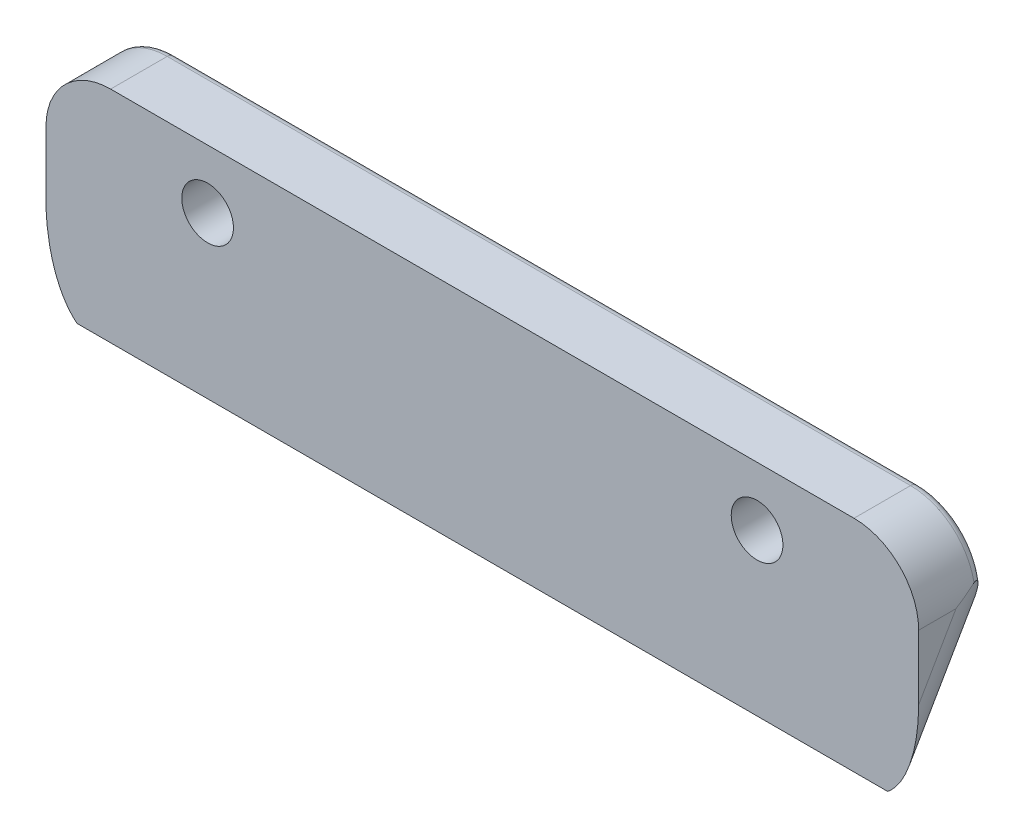
ISO-10303-21;
HEADER;
FILE_DESCRIPTION(('STEP AP214'),'2;1');
FILE_NAME('part.step','',(''),(''),'','','');
FILE_SCHEMA(('AUTOMOTIVE_DESIGN { 1 0 10303 214 1 1 1 1 }'));
ENDSEC;
DATA;
#1=APPLICATION_CONTEXT('core data for automotive mechanical design processes');
#2=APPLICATION_PROTOCOL_DEFINITION('international standard','automotive_design',2000,#1);
#3=PRODUCT_CONTEXT('',#1,'mechanical');
#4=PRODUCT('Part','Part','',(#3));
#5=PRODUCT_RELATED_PRODUCT_CATEGORY('part','',(#4));
#6=PRODUCT_DEFINITION_FORMATION('','',#4);
#7=PRODUCT_DEFINITION_CONTEXT('part definition',#1,'design');
#8=PRODUCT_DEFINITION('design','',#6,#7);
#9=PRODUCT_DEFINITION_SHAPE('','',#8);
#10=(LENGTH_UNIT() NAMED_UNIT(*) SI_UNIT(.MILLI.,.METRE.));
#11=(NAMED_UNIT(*) PLANE_ANGLE_UNIT() SI_UNIT($,.RADIAN.));
#12=(NAMED_UNIT(*) SI_UNIT($,.STERADIAN.) SOLID_ANGLE_UNIT());
#13=UNCERTAINTY_MEASURE_WITH_UNIT(LENGTH_MEASURE(1.E-05),#10,'distance_accuracy_value','');
#14=(GEOMETRIC_REPRESENTATION_CONTEXT(3) GLOBAL_UNCERTAINTY_ASSIGNED_CONTEXT((#13)) GLOBAL_UNIT_ASSIGNED_CONTEXT((#10,
#11,#12)) REPRESENTATION_CONTEXT('',''));
#15=CARTESIAN_POINT('',(0.,0.,0.));
#16=DIRECTION('',(0.,0.,1.));
#17=DIRECTION('',(1.,0.,0.));
#18=AXIS2_PLACEMENT_3D('',#15,#16,#17);
#19=CARTESIAN_POINT('',(73.,7.,0.));
#20=DIRECTION('',(0.,0.,-1.));
#21=DIRECTION('',(0.,1.,0.));
#22=AXIS2_PLACEMENT_3D('',#19,#20,#21);
#23=PLANE('',#22);
#24=CARTESIAN_POINT('',(68.,5.18,0.));
#25=DIRECTION('',(0.,0.,-1.));
#26=DIRECTION('',(-1.,0.,0.));
#27=AXIS2_PLACEMENT_3D('',#24,#25,#26);
#28=CIRCLE('',#27,0.799999999999995);
#29=CARTESIAN_POINT('',(67.2,5.18,0.));
#30=VERTEX_POINT('',#29);
#31=EDGE_CURVE('E237',#30,#30,#28,.T.);
#32=ORIENTED_EDGE('',*,*,#31,.T.);
#33=EDGE_LOOP('',(#32));
#34=FACE_BOUND('',#33,.T.);
#35=CARTESIAN_POINT('',(51.,5.18,0.));
#36=DIRECTION('',(0.,0.,-1.));
#37=DIRECTION('',(-1.,0.,0.));
#38=AXIS2_PLACEMENT_3D('',#35,#36,#37);
#39=CIRCLE('',#38,0.800000000000002);
#40=CARTESIAN_POINT('',(50.2,5.18,0.));
#41=VERTEX_POINT('',#40);
#42=EDGE_CURVE('E249',#41,#41,#39,.T.);
#43=ORIENTED_EDGE('',*,*,#42,.T.);
#44=EDGE_LOOP('',(#43));
#45=FACE_BOUND('',#44,.T.);
#46=DIRECTION('',(-1.,0.,0.));
#47=VECTOR('',#46,1.);
#48=CARTESIAN_POINT('',(73.,7.,0.));
#49=LINE('',#48,#47);
#50=CARTESIAN_POINT('',(71.,7.,0.));
#51=VERTEX_POINT('',#50);
#52=CARTESIAN_POINT('',(48.,7.,0.));
#53=VERTEX_POINT('',#52);
#54=EDGE_CURVE('E157',#51,#53,#49,.T.);
#55=ORIENTED_EDGE('',*,*,#54,.T.);
#56=CARTESIAN_POINT('',(48.,5.,0.));
#57=DIRECTION('',(0.,0.,-1.));
#58=DIRECTION('',(0.,1.,0.));
#59=AXIS2_PLACEMENT_3D('',#56,#57,#58);
#60=CIRCLE('',#59,2.);
#61=CARTESIAN_POINT('',(46.,5.,0.));
#62=VERTEX_POINT('',#61);
#63=EDGE_CURVE('E302',#53,#62,#60,.F.);
#64=ORIENTED_EDGE('',*,*,#63,.T.);
#65=DIRECTION('',(0.,-1.,0.));
#66=VECTOR('',#65,1.);
#67=CARTESIAN_POINT('',(46.,7.,0.));
#68=LINE('',#67,#66);
#69=CARTESIAN_POINT('',(46.,3.00000000000004,0.));
#70=VERTEX_POINT('',#69);
#71=EDGE_CURVE('E253',#62,#70,#68,.T.);
#72=ORIENTED_EDGE('',*,*,#71,.T.);
#73=CARTESIAN_POINT('',(47.5,3.00000000000004,0.));
#74=DIRECTION('',(0.,0.,-1.));
#75=DIRECTION('',(0.,1.,0.));
#76=AXIS2_PLACEMENT_3D('',#73,#74,#75);
#77=ELLIPSE('',#76,3.00000000000004,1.5);
#78=CARTESIAN_POINT('',(46.9614835192866,0.200000000000001,0.));
#79=VERTEX_POINT('',#78);
#80=EDGE_CURVE('E285',#70,#79,#77,.F.);
#81=ORIENTED_EDGE('',*,*,#80,.T.);
#82=DIRECTION('',(-1.,0.,0.));
#83=VECTOR('',#82,1.);
#84=CARTESIAN_POINT('',(73.,0.200000000000001,0.));
#85=LINE('',#84,#83);
#86=CARTESIAN_POINT('',(72.0385164807134,0.200000000000001,0.));
#87=VERTEX_POINT('',#86);
#88=EDGE_CURVE('E139',#87,#79,#85,.T.);
#89=ORIENTED_EDGE('',*,*,#88,.F.);
#90=CARTESIAN_POINT('',(71.5,3.00000000000004,0.));
#91=DIRECTION('',(0.,0.,-1.));
#92=DIRECTION('',(0.,-1.,0.));
#93=AXIS2_PLACEMENT_3D('',#90,#91,#92);
#94=ELLIPSE('',#93,3.00000000000004,1.5);
#95=CARTESIAN_POINT('',(73.,3.00000000000004,0.));
#96=VERTEX_POINT('',#95);
#97=EDGE_CURVE('E143',#87,#96,#94,.F.);
#98=ORIENTED_EDGE('',*,*,#97,.T.);
#99=DIRECTION('',(0.,-1.,0.));
#100=VECTOR('',#99,1.);
#101=CARTESIAN_POINT('',(73.,7.,0.));
#102=LINE('',#101,#100);
#103=CARTESIAN_POINT('',(73.,5.,0.));
#104=VERTEX_POINT('',#103);
#105=EDGE_CURVE('E129',#104,#96,#102,.T.);
#106=ORIENTED_EDGE('',*,*,#105,.F.);
#107=CARTESIAN_POINT('',(71.,5.,0.));
#108=DIRECTION('',(0.,0.,-1.));
#109=DIRECTION('',(0.,1.,0.));
#110=AXIS2_PLACEMENT_3D('',#107,#108,#109);
#111=CIRCLE('',#110,2.);
#112=EDGE_CURVE('E173',#104,#51,#111,.F.);
#113=ORIENTED_EDGE('',*,*,#112,.T.);
#114=EDGE_LOOP('',(#55,#64,#72,#81,#89,#98,#106,#113));
#115=FACE_BOUND('',#114,.T.);
#116=ADVANCED_FACE('F42',(#34,#45,#115),#23,.F.);
#117=CARTESIAN_POINT('',(73.,0.,0.));
#118=DIRECTION('',(0.,0.499999999999993,0.866025403784442));
#119=DIRECTION('',(0.,-0.866025403784443,0.499999999999993));
#120=AXIS2_PLACEMENT_3D('',#117,#118,#119);
#121=PLANE('',#120);
#122=DIRECTION('',(1.,0.,0.));
#123=VECTOR('',#122,1.);
#124=CARTESIAN_POINT('',(73.,0.200000000000001,-0.115470053837924));
#125=LINE('',#124,#123);
#126=CARTESIAN_POINT('',(47.5,0.200000000000001,-0.115470053837924));
#127=VERTEX_POINT('',#126);
#128=CARTESIAN_POINT('',(71.5,0.200000000000001,-0.115470053837924));
#129=VERTEX_POINT('',#128);
#130=EDGE_CURVE('E256',#127,#129,#125,.T.);
#131=ORIENTED_EDGE('',*,*,#130,.F.);
#132=DIRECTION('',(0.,0.866025403784443,-0.499999999999993));
#133=VECTOR('',#132,1.);
#134=CARTESIAN_POINT('',(47.5,0.,0.));
#135=LINE('',#134,#133);
#136=CARTESIAN_POINT('',(47.5,3.46410161513782,-2.));
#137=VERTEX_POINT('',#136);
#138=EDGE_CURVE('E187',#127,#137,#135,.T.);
#139=ORIENTED_EDGE('',*,*,#138,.T.);
#140=DIRECTION('',(-1.,0.,0.));
#141=VECTOR('',#140,1.);
#142=CARTESIAN_POINT('',(73.,3.46410161513782,-2.));
#143=LINE('',#142,#141);
#144=CARTESIAN_POINT('',(71.5,3.46410161513782,-2.));
#145=VERTEX_POINT('',#144);
#146=EDGE_CURVE('E138',#145,#137,#143,.T.);
#147=ORIENTED_EDGE('',*,*,#146,.F.);
#148=DIRECTION('',(0.,0.866025403784443,-0.499999999999993));
#149=VECTOR('',#148,1.);
#150=CARTESIAN_POINT('',(71.5,0.200000000000001,-0.115470053837924));
#151=LINE('',#150,#149);
#152=EDGE_CURVE('E161',#145,#129,#151,.F.);
#153=ORIENTED_EDGE('',*,*,#152,.T.);
#154=EDGE_LOOP('',(#131,#139,#147,#153));
#155=FACE_BOUND('',#154,.T.);
#156=ADVANCED_FACE('F273',(#155),#121,.F.);
#157=CARTESIAN_POINT('',(73.,0.,0.));
#158=DIRECTION('',(1.,0.,0.));
#159=DIRECTION('',(0.,0.,-1.));
#160=AXIS2_PLACEMENT_3D('',#157,#158,#159);
#161=PLANE('',#160);
#162=DIRECTION('',(0.,0.866025403784443,-0.499999999999993));
#163=VECTOR('',#162,1.);
#164=CARTESIAN_POINT('',(73.,4.21410161513781,-0.700961894323337));
#165=LINE('',#164,#163);
#166=CARTESIAN_POINT('',(73.,5.,-1.15470053837921));
#167=VERTEX_POINT('',#166);
#168=EDGE_CURVE('E133',#96,#167,#165,.T.);
#169=ORIENTED_EDGE('',*,*,#168,.T.);
#170=DIRECTION('',(0.,0.,1.));
#171=VECTOR('',#170,1.);
#172=CARTESIAN_POINT('',(73.,5.,0.));
#173=LINE('',#172,#171);
#174=EDGE_CURVE('E135',#167,#104,#173,.T.);
#175=ORIENTED_EDGE('',*,*,#174,.T.);
#176=ORIENTED_EDGE('',*,*,#105,.T.);
#177=EDGE_LOOP('',(#169,#175,#176));
#178=FACE_BOUND('',#177,.T.);
#179=ADVANCED_FACE('F131',(#178),#161,.T.);
#180=CARTESIAN_POINT('',(73.,7.,-2.));
#181=DIRECTION('',(0.,-1.,0.));
#182=DIRECTION('',(0.,0.,-1.));
#183=AXIS2_PLACEMENT_3D('',#180,#181,#182);
#184=PLANE('',#183);
#185=DIRECTION('',(0.,0.,1.));
#186=VECTOR('',#185,1.);
#187=CARTESIAN_POINT('',(71.,7.,-2.));
#188=LINE('',#187,#186);
#189=CARTESIAN_POINT('',(71.,7.,-1.75));
#190=VERTEX_POINT('',#189);
#191=EDGE_CURVE('E176',#51,#190,#188,.F.);
#192=ORIENTED_EDGE('',*,*,#191,.T.);
#193=DIRECTION('',(-1.,0.,0.));
#194=VECTOR('',#193,1.);
#195=CARTESIAN_POINT('',(73.,7.,-1.75));
#196=LINE('',#195,#194);
#197=CARTESIAN_POINT('',(48.,7.,-1.75));
#198=VERTEX_POINT('',#197);
#199=EDGE_CURVE('E11',#190,#198,#196,.T.);
#200=ORIENTED_EDGE('',*,*,#199,.T.);
#201=DIRECTION('',(0.,0.,-1.));
#202=VECTOR('',#201,1.);
#203=CARTESIAN_POINT('',(48.,7.,-2.));
#204=LINE('',#203,#202);
#205=EDGE_CURVE('E299',#198,#53,#204,.F.);
#206=ORIENTED_EDGE('',*,*,#205,.T.);
#207=ORIENTED_EDGE('',*,*,#54,.F.);
#208=EDGE_LOOP('',(#192,#200,#206,#207));
#209=FACE_BOUND('',#208,.T.);
#210=ADVANCED_FACE('F342',(#209),#184,.F.);
#211=CARTESIAN_POINT('',(73.,3.46410161513782,-2.));
#212=DIRECTION('',(0.,0.,1.));
#213=DIRECTION('',(1.,0.,0.));
#214=AXIS2_PLACEMENT_3D('',#211,#212,#213);
#215=PLANE('',#214);
#216=CARTESIAN_POINT('',(68.,5.18,-2.));
#217=DIRECTION('',(0.,0.,-1.));
#218=DIRECTION('',(-1.,0.,0.));
#219=AXIS2_PLACEMENT_3D('',#216,#217,#218);
#220=CIRCLE('',#219,0.799999999999995);
#221=CARTESIAN_POINT('',(67.2,5.18,-2.));
#222=VERTEX_POINT('',#221);
#223=EDGE_CURVE('E231',#222,#222,#220,.T.);
#224=ORIENTED_EDGE('',*,*,#223,.F.);
#225=EDGE_LOOP('',(#224));
#226=FACE_BOUND('',#225,.T.);
#227=CARTESIAN_POINT('',(51.,5.18,-2.));
#228=DIRECTION('',(0.,0.,-1.));
#229=DIRECTION('',(-1.,0.,0.));
#230=AXIS2_PLACEMENT_3D('',#227,#228,#229);
#231=CIRCLE('',#230,0.799999999999988);
#232=CARTESIAN_POINT('',(50.2,5.18,-2.));
#233=VERTEX_POINT('',#232);
#234=EDGE_CURVE('E243',#233,#233,#231,.T.);
#235=ORIENTED_EDGE('',*,*,#234,.F.);
#236=EDGE_LOOP('',(#235));
#237=FACE_BOUND('',#236,.T.);
#238=DIRECTION('',(-1.,0.,0.));
#239=VECTOR('',#238,1.);
#240=CARTESIAN_POINT('',(73.,6.75,-2.));
#241=LINE('',#240,#239);
#242=CARTESIAN_POINT('',(48.,6.75,-2.));
#243=VERTEX_POINT('',#242);
#244=CARTESIAN_POINT('',(71.,6.75,-2.));
#245=VERTEX_POINT('',#244);
#246=EDGE_CURVE('E305',#243,#245,#241,.F.);
#247=ORIENTED_EDGE('',*,*,#246,.T.);
#248=CARTESIAN_POINT('',(71.,5.,-2.));
#249=DIRECTION('',(0.,0.,1.));
#250=DIRECTION('',(1.,0.,0.));
#251=AXIS2_PLACEMENT_3D('',#248,#249,#250);
#252=CIRCLE('',#251,1.75);
#253=CARTESIAN_POINT('',(72.7327558935881,4.75493467557492,-2.));
#254=VERTEX_POINT('',#253);
#255=EDGE_CURVE('E313',#245,#254,#252,.F.);
#256=ORIENTED_EDGE('',*,*,#255,.T.);
#257=CARTESIAN_POINT('',(71.5,6.46410161513786,-2.));
#258=DIRECTION('',(0.,0.,1.));
#259=DIRECTION('',(0.,-1.,0.));
#260=AXIS2_PLACEMENT_3D('',#257,#258,#259);
#261=ELLIPSE('',#260,3.00000000000004,1.5);
#262=EDGE_CURVE('E156',#254,#145,#261,.F.);
#263=ORIENTED_EDGE('',*,*,#262,.T.);
#264=ORIENTED_EDGE('',*,*,#146,.T.);
#265=CARTESIAN_POINT('',(47.5,6.46410161513786,-2.));
#266=DIRECTION('',(0.,0.,1.));
#267=DIRECTION('',(0.,1.,0.));
#268=AXIS2_PLACEMENT_3D('',#265,#266,#267);
#269=ELLIPSE('',#268,3.00000000000004,1.5);
#270=CARTESIAN_POINT('',(46.2672441064119,4.75493467557492,-2.));
#271=VERTEX_POINT('',#270);
#272=EDGE_CURVE('E266',#137,#271,#269,.F.);
#273=ORIENTED_EDGE('',*,*,#272,.T.);
#274=CARTESIAN_POINT('',(48.,5.,-2.));
#275=DIRECTION('',(0.,0.,1.));
#276=DIRECTION('',(1.,0.,0.));
#277=AXIS2_PLACEMENT_3D('',#274,#275,#276);
#278=CIRCLE('',#277,1.75);
#279=EDGE_CURVE('E310',#271,#243,#278,.F.);
#280=ORIENTED_EDGE('',*,*,#279,.T.);
#281=EDGE_LOOP('',(#247,#256,#263,#264,#273,#280));
#282=FACE_BOUND('',#281,.T.);
#283=ADVANCED_FACE('F265',(#226,#237,#282),#215,.F.);
#284=CARTESIAN_POINT('',(73.,0.200000000000001,-5.));
#285=DIRECTION('',(0.,-1.,0.));
#286=DIRECTION('',(0.,0.,-1.));
#287=AXIS2_PLACEMENT_3D('',#284,#285,#286);
#288=PLANE('',#287);
#289=ORIENTED_EDGE('',*,*,#88,.T.);
#290=CARTESIAN_POINT('',(47.5,0.2,1.61658075373095));
#291=DIRECTION('',(0.,-1.,0.));
#292=DIRECTION('',(0.,0.,-1.));
#293=AXIS2_PLACEMENT_3D('',#290,#291,#292);
#294=ELLIPSE('',#293,1.73205080756887,1.5);
#295=EDGE_CURVE('E278',#79,#127,#294,.T.);
#296=ORIENTED_EDGE('',*,*,#295,.T.);
#297=ORIENTED_EDGE('',*,*,#130,.T.);
#298=CARTESIAN_POINT('',(71.5,0.2,1.61658075373094));
#299=DIRECTION('',(0.,-1.,0.));
#300=DIRECTION('',(0.,0.,1.));
#301=AXIS2_PLACEMENT_3D('',#298,#299,#300);
#302=ELLIPSE('',#301,1.73205080756887,1.5);
#303=EDGE_CURVE('E149',#129,#87,#302,.T.);
#304=ORIENTED_EDGE('',*,*,#303,.T.);
#305=EDGE_LOOP('',(#289,#296,#297,#304));
#306=FACE_BOUND('',#305,.T.);
#307=ADVANCED_FACE('F276',(#306),#288,.T.);
#308=CARTESIAN_POINT('',(71.5,0.749999999999989,1.29903810567666));
#309=DIRECTION('',(0.,-0.866025403784443,0.499999999999993));
#310=DIRECTION('',(0.,-0.499999999999993,-0.866025403784443));
#311=AXIS2_PLACEMENT_3D('',#308,#309,#310);
#312=CYLINDRICAL_SURFACE('',#311,1.5);
#313=ORIENTED_EDGE('',*,*,#262,.F.);
#314=CARTESIAN_POINT('',(72.7327558935881,4.75493467557493,-2.));
#315=CARTESIAN_POINT('',(72.7395170974083,4.77444049978442,-1.99999775763626));
#316=CARTESIAN_POINT('',(72.7461756716318,4.79398250895714,-1.99990602112907));
#317=CARTESIAN_POINT('',(72.7593230730698,4.83312800297112,-1.99945471471934));
#318=CARTESIAN_POINT('',(72.7658118394572,4.8527315070991,-1.99909505016552));
#319=CARTESIAN_POINT('',(72.7852432670711,4.91212775323866,-1.99746630332613));
#320=CARTESIAN_POINT('',(72.7979699111735,4.95197764912317,-1.99564259078778));
#321=CARTESIAN_POINT('',(72.8233529867402,5.03233978980987,-1.98940656331436));
#322=CARTESIAN_POINT('',(72.8360040362125,5.07285105322397,-1.98494826958053));
#323=CARTESIAN_POINT('',(72.8548885432478,5.13296902294581,-1.97486735389876));
#324=CARTESIAN_POINT('',(72.8611511689767,5.15284713828531,-1.97095663186988));
#325=CARTESIAN_POINT('',(72.8736752519363,5.1922409568881,-1.96163079661194));
#326=CARTESIAN_POINT('',(72.8799367026208,5.21175704109388,-1.95621737309272));
#327=CARTESIAN_POINT('',(72.8898343711833,5.24204076938239,-1.94605657531098));
#328=CARTESIAN_POINT('',(72.8934670811476,5.2530355185594,-1.94198672323065));
#329=CARTESIAN_POINT('',(72.9007516942952,5.27472893262587,-1.93298748702939));
#330=CARTESIAN_POINT('',(72.9044036122319,5.28542610159674,-1.92805444115827));
#331=CARTESIAN_POINT('',(72.9127244853669,5.30920930509752,-1.91562471093036));
#332=CARTESIAN_POINT('',(72.9173921004261,5.32212626396022,-1.90779692010482));
#333=CARTESIAN_POINT('',(72.9266538936081,5.34630250290987,-1.88988426453134));
#334=CARTESIAN_POINT('',(72.9312483603601,5.3575743404792,-1.87981815907657));
#335=CARTESIAN_POINT('',(72.9374496696154,5.37090070312588,-1.86384792442803));
#336=CARTESIAN_POINT('',(72.939161571736,5.37437001478333,-1.85917471218608));
#337=CARTESIAN_POINT('',(72.942527484565,5.38063878533565,-1.84936723691236));
#338=CARTESIAN_POINT('',(72.9441814695126,5.38343794930872,-1.84423277225237));
#339=CARTESIAN_POINT('',(72.9474130937451,5.38818355748631,-1.83347214001841));
#340=CARTESIAN_POINT('',(72.948989586239,5.3901194257173,-1.8278408353296));
#341=CARTESIAN_POINT('',(72.951989442459,5.39285820087968,-1.81627573374772));
#342=CARTESIAN_POINT('',(72.9534131932607,5.39366403730887,-1.81034276048165));
#343=CARTESIAN_POINT('',(72.9559223029142,5.3939962904921,-1.79901024729969));
#344=CARTESIAN_POINT('',(72.9570274047894,5.39364577185487,-1.79361860380967));
#345=CARTESIAN_POINT('',(72.9590552908755,5.391946304517,-1.7829467237814));
#346=CARTESIAN_POINT('',(72.9599776117549,5.39059485858582,-1.7776667999229));
#347=CARTESIAN_POINT('',(72.9614448434276,5.38742796238778,-1.76857350672998));
#348=CARTESIAN_POINT('',(72.9620277839896,5.38579034628646,-1.76470180302338));
#349=CARTESIAN_POINT('',(72.9630884674966,5.38208304500356,-1.7571821587168));
#350=CARTESIAN_POINT('',(72.9635667838573,5.38001584259055,-1.75353308172655));
#351=CARTESIAN_POINT('',(72.9639989042006,5.3777675267924,-1.75000000000027));
#352=B_SPLINE_CURVE_WITH_KNOTS('',3,(#314,#315,#316,#317,#318,#319,#320,#321,#322,#323,#324,
#325,#326,#327,#328,#329,#330,#331,#332,#333,#334,#335,#336,#337,#338,#339,#340,#341,#342,#343,
#344,#345,#346,#347,#348,#349,#350,#351),.UNSPECIFIED.,.F.,.F.,(4,2,2,2,2,2,2,2,2,2,2,2,2,2,2,2,
2,2,4),(0.,0.0619335280278836,0.123888945772995,0.249475074404342,0.377320500881206,
0.440899190720418,0.5044066772129,0.541202845028607,0.57815906713712,0.62545584420112,
0.67237024330051,0.690527962694336,0.708693658395345,0.72707616243203,0.74541092295429,
0.761859944604576,0.778350144032809,0.791053346399666,0.803685077327109),.UNSPECIFIED.);
#353=CARTESIAN_POINT('',(72.9639989042011,5.37776752679322,-1.74999999999999));
#354=VERTEX_POINT('',#353);
#355=EDGE_CURVE('E316',#254,#354,#352,.T.);
#356=ORIENTED_EDGE('',*,*,#355,.T.);
#357=CARTESIAN_POINT('',(72.9265702218557,5.53696106028184,-2.));
#358=CARTESIAN_POINT('',(72.9388757188599,5.4927860477756,-1.93074399078035));
#359=CARTESIAN_POINT('',(72.9495772662274,5.44854091117917,-1.86126870188502));
#360=CARTESIAN_POINT('',(72.9678668561814,5.35993391776195,-1.72197413472637));
#361=CARTESIAN_POINT('',(72.9754546269643,5.31557205109173,-1.65215482697154));
#362=CARTESIAN_POINT('',(72.9936512454994,5.18261292564464,-1.44274208927757));
#363=CARTESIAN_POINT('',(72.9997628618398,5.09388843759482,-1.30279543343849));
#364=CARTESIAN_POINT('',(72.9999977367986,5.00346886347651,-1.16017215074148));
#365=CARTESIAN_POINT('',(72.9999999926982,5.00173442342607,-1.15743633124916));
#366=CARTESIAN_POINT('',(73.0000000000032,5.,-1.15470053837921));
#367=B_SPLINE_CURVE_WITH_KNOTS('',3,(#357,#358,#359,#360,#361,#362,#363,#364,#365,#366),
.UNSPECIFIED.,.F.,.F.,(4,2,2,2,4),(0.,0.249136779543129,0.498295301776333,0.99518329594325,
1.00490115988303),.UNSPECIFIED.);
#368=EDGE_CURVE('E154',#354,#167,#367,.T.);
#369=ORIENTED_EDGE('',*,*,#368,.T.);
#370=ORIENTED_EDGE('',*,*,#168,.F.);
#371=ORIENTED_EDGE('',*,*,#97,.F.);
#372=ORIENTED_EDGE('',*,*,#303,.F.);
#373=ORIENTED_EDGE('',*,*,#152,.F.);
#374=EDGE_LOOP('',(#313,#356,#369,#370,#371,#372,#373));
#375=FACE_BOUND('',#374,.T.);
#376=ADVANCED_FACE('F152',(#375),#312,.T.);
#377=CARTESIAN_POINT('',(71.,5.,0.));
#378=DIRECTION('',(0.,0.,-1.));
#379=DIRECTION('',(-1.,0.,0.));
#380=AXIS2_PLACEMENT_3D('',#377,#378,#379);
#381=CYLINDRICAL_SURFACE('',#380,2.);
#382=ORIENTED_EDGE('',*,*,#368,.F.);
#383=CARTESIAN_POINT('',(71.,5.,-1.75));
#384=DIRECTION('',(0.,0.,1.));
#385=DIRECTION('',(1.,0.,0.));
#386=AXIS2_PLACEMENT_3D('',#383,#384,#385);
#387=CIRCLE('',#386,2.);
#388=EDGE_CURVE('E322',#354,#190,#387,.T.);
#389=ORIENTED_EDGE('',*,*,#388,.T.);
#390=ORIENTED_EDGE('',*,*,#191,.F.);
#391=ORIENTED_EDGE('',*,*,#112,.F.);
#392=ORIENTED_EDGE('',*,*,#174,.F.);
#393=EDGE_LOOP('',(#382,#389,#390,#391,#392));
#394=FACE_BOUND('',#393,.T.);
#395=ADVANCED_FACE('F191',(#394),#381,.T.);
#396=CARTESIAN_POINT('',(46.,7.,0.));
#397=DIRECTION('',(1.,0.,0.));
#398=DIRECTION('',(0.,0.,-1.));
#399=AXIS2_PLACEMENT_3D('',#396,#397,#398);
#400=PLANE('',#399);
#401=ORIENTED_EDGE('',*,*,#71,.F.);
#402=DIRECTION('',(0.,0.,-1.));
#403=VECTOR('',#402,1.);
#404=CARTESIAN_POINT('',(46.,5.,0.));
#405=LINE('',#404,#403);
#406=CARTESIAN_POINT('',(46.,5.,-1.15470053837921));
#407=VERTEX_POINT('',#406);
#408=EDGE_CURVE('E291',#62,#407,#405,.T.);
#409=ORIENTED_EDGE('',*,*,#408,.T.);
#410=DIRECTION('',(0.,0.866025403784443,-0.499999999999993));
#411=VECTOR('',#410,1.);
#412=CARTESIAN_POINT('',(46.,6.00000000000004,-1.73205080756884));
#413=LINE('',#412,#411);
#414=EDGE_CURVE('E282',#407,#70,#413,.F.);
#415=ORIENTED_EDGE('',*,*,#414,.T.);
#416=EDGE_LOOP('',(#401,#409,#415));
#417=FACE_BOUND('',#416,.T.);
#418=ADVANCED_FACE('F195',(#417),#400,.F.);
#419=CARTESIAN_POINT('',(47.5,0.74999999999999,1.29903810567666));
#420=DIRECTION('',(0.,0.866025403784443,-0.499999999999993));
#421=DIRECTION('',(0.,0.499999999999993,0.866025403784443));
#422=AXIS2_PLACEMENT_3D('',#419,#420,#421);
#423=CYLINDRICAL_SURFACE('',#422,1.5);
#424=CARTESIAN_POINT('',(46.0734297781443,5.53696106028185,-2.));
#425=CARTESIAN_POINT('',(46.0611242811348,5.49278604777567,-1.93074399078045));
#426=CARTESIAN_POINT('',(46.05042273377,5.4485409111793,-1.86126870188521));
#427=CARTESIAN_POINT('',(46.0321331438211,5.35993391776101,-1.7219741347249));
#428=CARTESIAN_POINT('',(46.0245453730407,5.31557205108966,-1.6521548269683));
#429=CARTESIAN_POINT('',(46.0063487544898,5.18261292564253,-1.44274208927421));
#430=CARTESIAN_POINT('',(46.0002371381068,5.09388843759385,-1.3027954334368));
#431=CARTESIAN_POINT('',(46.0000022632024,5.00346886347651,-1.16017215074147));
#432=CARTESIAN_POINT('',(46.0000000073039,5.00173442342607,-1.15743633124916));
#433=CARTESIAN_POINT('',(46.,5.,-1.15470053837921));
#434=B_SPLINE_CURVE_WITH_KNOTS('',3,(#424,#425,#426,#427,#428,#429,#430,#431,#432,#433),
.UNSPECIFIED.,.F.,.F.,(4,2,2,2,4),(0.,0.249136779542787,0.498295301782287,0.995183295943261,
1.00490115988303),.UNSPECIFIED.);
#435=CARTESIAN_POINT('',(46.0360010957989,5.37776752679322,-1.74999999999999));
#436=VERTEX_POINT('',#435);
#437=EDGE_CURVE('E207',#407,#436,#434,.F.);
#438=ORIENTED_EDGE('',*,*,#437,.T.);
#439=CARTESIAN_POINT('',(46.0360010957995,5.37776752679311,-1.75));
#440=CARTESIAN_POINT('',(46.0365549593556,5.38065944225779,-1.75453316140147));
#441=CARTESIAN_POINT('',(46.0371876625482,5.38324919026018,-1.75927093236486));
#442=CARTESIAN_POINT('',(46.0386265082633,5.38767943157251,-1.76907975913193));
#443=CARTESIAN_POINT('',(46.0394333143893,5.3895169779483,-1.77415203707979));
#444=CARTESIAN_POINT('',(46.0412379520821,5.39228211923373,-1.78455140138889));
#445=CARTESIAN_POINT('',(46.042237006247,5.39320364408744,-1.78987994538527));
#446=CARTESIAN_POINT('',(46.0444087346187,5.39403238547678,-1.80056455293451));
#447=CARTESIAN_POINT('',(46.0455808989678,5.39394252426917,-1.80592049253209));
#448=CARTESIAN_POINT('',(46.0479679999906,5.3928372203946,-1.81605371413035));
#449=CARTESIAN_POINT('',(46.0491715566535,5.39189824380431,-1.82084244412873));
#450=CARTESIAN_POINT('',(46.0516728709404,5.3892957156052,-1.83019666839322));
#451=CARTESIAN_POINT('',(46.0529707801422,5.3876309756173,-1.83476178281132));
#452=CARTESIAN_POINT('',(46.0562802173832,5.38274241547406,-1.84575211877175));
#453=CARTESIAN_POINT('',(46.0583318604472,5.37915410277162,-1.85200241923024));
#454=CARTESIAN_POINT('',(46.0625159864069,5.37102710429904,-1.86381475581681));
#455=CARTESIAN_POINT('',(46.0646486373382,5.36648634354213,-1.86937524633746));
#456=CARTESIAN_POINT('',(46.0704426003051,5.35338471310994,-1.88347163628806));
#457=CARTESIAN_POINT('',(46.0741440273794,5.34421072266927,-1.89141552383899));
#458=CARTESIAN_POINT('',(46.0815859060484,5.32480260714835,-1.90583202906902));
#459=CARTESIAN_POINT('',(46.08532643259,5.31456586327283,-1.9123008804807));
#460=CARTESIAN_POINT('',(46.096870861829,5.28205095892015,-1.93046825813432));
#461=CARTESIAN_POINT('',(46.1046931123383,5.25872613256349,-1.94025400863849));
#462=CARTESIAN_POINT('',(46.1203584684811,5.21090282425802,-1.95667711865003));
#463=CARTESIAN_POINT('',(46.1282012693585,5.18639667536131,-1.96328960376377));
#464=CARTESIAN_POINT('',(46.1468717065873,5.12749054660524,-1.97639155796167));
#465=CARTESIAN_POINT('',(46.1577001298088,5.09287238686278,-1.98187779485231));
#466=CARTESIAN_POINT('',(46.1795067994631,5.02332018401501,-1.990239904342));
#467=CARTESIAN_POINT('',(46.1904853562155,4.98838556245609,-1.99310912152852));
#468=CARTESIAN_POINT('',(46.2122053843146,4.92020140225282,-1.99709879527887));
#469=CARTESIAN_POINT('',(46.2229328970603,4.88695155913023,-1.99829666116092));
#470=CARTESIAN_POINT('',(46.244759747286,4.82074180223127,-1.99972979502007));
#471=CARTESIAN_POINT('',(46.2558568758015,4.78778127824031,-1.99997000740613));
#472=CARTESIAN_POINT('',(46.2672441064119,4.75493467557493,-2.00000000000004));
#473=B_SPLINE_CURVE_WITH_KNOTS('',3,(#439,#440,#441,#442,#443,#444,#445,#446,#447,#448,#449,
#450,#451,#452,#453,#454,#455,#456,#457,#458,#459,#460,#461,#462,#463,#464,#465,#466,#467,#468,
#469,#470,#471,#472),.UNSPECIFIED.,.F.,.F.,(4,2,2,2,2,2,2,2,2,2,2,2,2,2,2,2,4),(0.,
0.0162318566104381,0.0325267105225326,0.0489288371860643,0.0652835844233719,0.0802978655684442,
0.0953368242722777,0.117688632892432,0.140089652166147,0.177936375362934,0.215878678156582,
0.294866089064986,0.374462938055957,0.484331984239831,0.594479668530737,0.699334320932492,
0.803646897355515),.UNSPECIFIED.);
#474=EDGE_CURVE('E53',#436,#271,#473,.T.);
#475=ORIENTED_EDGE('',*,*,#474,.T.);
#476=ORIENTED_EDGE('',*,*,#272,.F.);
#477=ORIENTED_EDGE('',*,*,#138,.F.);
#478=ORIENTED_EDGE('',*,*,#295,.F.);
#479=ORIENTED_EDGE('',*,*,#80,.F.);
#480=ORIENTED_EDGE('',*,*,#414,.F.);
#481=EDGE_LOOP('',(#438,#475,#476,#477,#478,#479,#480));
#482=FACE_BOUND('',#481,.T.);
#483=ADVANCED_FACE('F197',(#482),#423,.T.);
#484=CARTESIAN_POINT('',(48.,5.,0.));
#485=DIRECTION('',(0.,0.,-1.));
#486=DIRECTION('',(-1.,0.,0.));
#487=AXIS2_PLACEMENT_3D('',#484,#485,#486);
#488=CYLINDRICAL_SURFACE('',#487,2.);
#489=ORIENTED_EDGE('',*,*,#205,.F.);
#490=CARTESIAN_POINT('',(48.,5.,-1.75));
#491=DIRECTION('',(0.,0.,1.));
#492=DIRECTION('',(1.,0.,0.));
#493=AXIS2_PLACEMENT_3D('',#490,#491,#492);
#494=CIRCLE('',#493,2.);
#495=EDGE_CURVE('E61',#198,#436,#494,.T.);
#496=ORIENTED_EDGE('',*,*,#495,.T.);
#497=ORIENTED_EDGE('',*,*,#437,.F.);
#498=ORIENTED_EDGE('',*,*,#408,.F.);
#499=ORIENTED_EDGE('',*,*,#63,.F.);
#500=EDGE_LOOP('',(#489,#496,#497,#498,#499));
#501=FACE_BOUND('',#500,.T.);
#502=ADVANCED_FACE('F201',(#501),#488,.T.);
#503=CARTESIAN_POINT('',(51.,5.18,-2.));
#504=DIRECTION('',(0.,0.,-1.));
#505=DIRECTION('',(-1.,0.,0.));
#506=AXIS2_PLACEMENT_3D('',#503,#504,#505);
#507=CYLINDRICAL_SURFACE('',#506,0.799999999999995);
#508=ORIENTED_EDGE('',*,*,#42,.F.);
#509=EDGE_LOOP('',(#508));
#510=FACE_BOUND('',#509,.T.);
#511=ORIENTED_EDGE('',*,*,#234,.T.);
#512=EDGE_LOOP('',(#511));
#513=FACE_BOUND('',#512,.T.);
#514=ADVANCED_FACE('F355',(#510,#513),#507,.F.);
#515=CARTESIAN_POINT('',(68.,5.18,-2.));
#516=DIRECTION('',(0.,0.,-1.));
#517=DIRECTION('',(-1.,0.,0.));
#518=AXIS2_PLACEMENT_3D('',#515,#516,#517);
#519=CYLINDRICAL_SURFACE('',#518,0.799999999999995);
#520=ORIENTED_EDGE('',*,*,#31,.F.);
#521=EDGE_LOOP('',(#520));
#522=FACE_BOUND('',#521,.T.);
#523=ORIENTED_EDGE('',*,*,#223,.T.);
#524=EDGE_LOOP('',(#523));
#525=FACE_BOUND('',#524,.T.);
#526=ADVANCED_FACE('F331',(#522,#525),#519,.F.);
#527=CARTESIAN_POINT('',(48.,5.,-1.75));
#528=DIRECTION('',(0.,0.,1.));
#529=DIRECTION('',(1.,0.,0.));
#530=AXIS2_PLACEMENT_3D('',#527,#528,#529);
#531=TOROIDAL_SURFACE('',#530,1.75,0.25);
#532=ORIENTED_EDGE('',*,*,#474,.F.);
#533=ORIENTED_EDGE('',*,*,#495,.F.);
#534=CARTESIAN_POINT('',(48.,6.75,-1.75));
#535=DIRECTION('',(1.,0.,0.));
#536=DIRECTION('',(0.,0.,-1.));
#537=AXIS2_PLACEMENT_3D('',#534,#535,#536);
#538=CIRCLE('',#537,0.25);
#539=EDGE_CURVE('E47',#243,#198,#538,.T.);
#540=ORIENTED_EDGE('',*,*,#539,.F.);
#541=ORIENTED_EDGE('',*,*,#279,.F.);
#542=EDGE_LOOP('',(#532,#533,#540,#541));
#543=FACE_BOUND('',#542,.T.);
#544=ADVANCED_FACE('F44',(#543),#531,.T.);
#545=CARTESIAN_POINT('',(73.,6.75,-1.75));
#546=DIRECTION('',(-1.,0.,0.));
#547=DIRECTION('',(0.,0.,1.));
#548=AXIS2_PLACEMENT_3D('',#545,#546,#547);
#549=CYLINDRICAL_SURFACE('',#548,0.25);
#550=ORIENTED_EDGE('',*,*,#539,.T.);
#551=ORIENTED_EDGE('',*,*,#199,.F.);
#552=CARTESIAN_POINT('',(71.,6.75,-1.75));
#553=DIRECTION('',(1.,0.,0.));
#554=DIRECTION('',(0.,0.,-1.));
#555=AXIS2_PLACEMENT_3D('',#552,#553,#554);
#556=CIRCLE('',#555,0.25);
#557=EDGE_CURVE('E222',#245,#190,#556,.T.);
#558=ORIENTED_EDGE('',*,*,#557,.F.);
#559=ORIENTED_EDGE('',*,*,#246,.F.);
#560=EDGE_LOOP('',(#550,#551,#558,#559));
#561=FACE_BOUND('',#560,.T.);
#562=ADVANCED_FACE('F326',(#561),#549,.T.);
#563=CARTESIAN_POINT('',(71.,5.,-1.75));
#564=DIRECTION('',(0.,0.,1.));
#565=DIRECTION('',(1.,0.,0.));
#566=AXIS2_PLACEMENT_3D('',#563,#564,#565);
#567=TOROIDAL_SURFACE('',#566,1.75,0.25);
#568=ORIENTED_EDGE('',*,*,#557,.T.);
#569=ORIENTED_EDGE('',*,*,#388,.F.);
#570=ORIENTED_EDGE('',*,*,#355,.F.);
#571=ORIENTED_EDGE('',*,*,#255,.F.);
#572=EDGE_LOOP('',(#568,#569,#570,#571));
#573=FACE_BOUND('',#572,.T.);
#574=ADVANCED_FACE('F323',(#573),#567,.T.);
#575=CLOSED_SHELL('',(#116,#156,#179,#210,#283,#307,#376,#395,#418,#483,#502,#514,#526,#544,
#562,#574));
#576=MANIFOLD_SOLID_BREP('B2',#575);
#577=ADVANCED_BREP_SHAPE_REPRESENTATION('',(#18,#576),#14);
#578=SHAPE_DEFINITION_REPRESENTATION(#9,#577);
ENDSEC;
END-ISO-10303-21;
